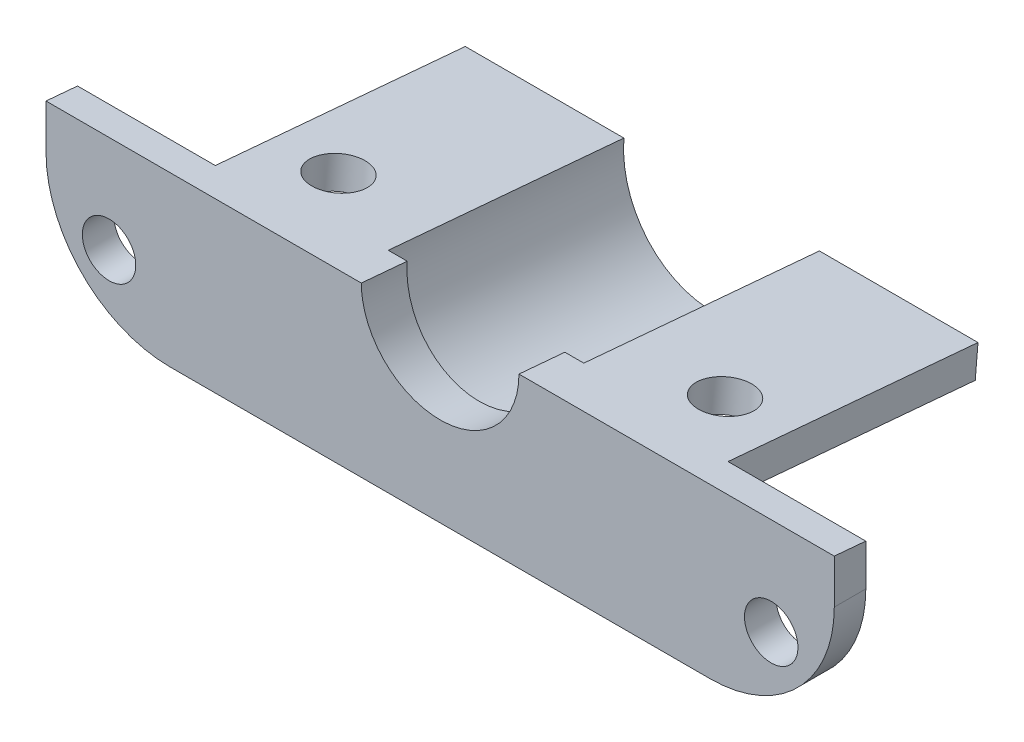
ISO-10303-21;
HEADER;
FILE_DESCRIPTION(('STEP AP214'),'2;1');
FILE_NAME('part.step','',(''),(''),'','','');
FILE_SCHEMA(('AUTOMOTIVE_DESIGN { 1 0 10303 214 1 1 1 1 }'));
ENDSEC;
DATA;
#1=APPLICATION_CONTEXT('core data for automotive mechanical design processes');
#2=APPLICATION_PROTOCOL_DEFINITION('international standard','automotive_design',2000,#1);
#3=PRODUCT_CONTEXT('',#1,'mechanical');
#4=PRODUCT('Part','Part','',(#3));
#5=PRODUCT_RELATED_PRODUCT_CATEGORY('part','',(#4));
#6=PRODUCT_DEFINITION_FORMATION('','',#4);
#7=PRODUCT_DEFINITION_CONTEXT('part definition',#1,'design');
#8=PRODUCT_DEFINITION('design','',#6,#7);
#9=PRODUCT_DEFINITION_SHAPE('','',#8);
#10=(LENGTH_UNIT() NAMED_UNIT(*) SI_UNIT(.MILLI.,.METRE.));
#11=(NAMED_UNIT(*) PLANE_ANGLE_UNIT() SI_UNIT($,.RADIAN.));
#12=(NAMED_UNIT(*) SI_UNIT($,.STERADIAN.) SOLID_ANGLE_UNIT());
#13=UNCERTAINTY_MEASURE_WITH_UNIT(LENGTH_MEASURE(1.E-05),#10,'distance_accuracy_value','');
#14=(GEOMETRIC_REPRESENTATION_CONTEXT(3) GLOBAL_UNCERTAINTY_ASSIGNED_CONTEXT((#13)) GLOBAL_UNIT_ASSIGNED_CONTEXT((#10,
#11,#12)) REPRESENTATION_CONTEXT('',''));
#15=CARTESIAN_POINT('',(0.,0.,0.));
#16=DIRECTION('',(0.,0.,1.));
#17=DIRECTION('',(1.,0.,0.));
#18=AXIS2_PLACEMENT_3D('',#15,#16,#17);
#19=CARTESIAN_POINT('',(0.,3.94962780103435,-0.34554765773733));
#20=DIRECTION('',(0.,0.996194698091746,-0.0871557427476584));
#21=DIRECTION('',(0.,0.0871557427476584,0.996194698091746));
#22=AXIS2_PLACEMENT_3D('',#19,#20,#21);
#23=PLANE('',#22);
#24=DIRECTION('',(0.,-0.0871557427476584,-0.996194698091745));
#25=VECTOR('',#24,1.);
#26=CARTESIAN_POINT('',(6.35,0.222315625568186,-42.9489207720347));
#27=LINE('',#26,#25);
#28=CARTESIAN_POINT('',(6.35,-0.101294306791094,-46.6477992245943));
#29=VERTEX_POINT('',#28);
#30=CARTESIAN_POINT('',(6.35,0.222221205355858,-42.95));
#31=VERTEX_POINT('',#30);
#32=EDGE_CURVE('E62',#29,#31,#27,.F.);
#33=ORIENTED_EDGE('',*,*,#32,.T.);
#34=DIRECTION('',(1.,0.,0.));
#35=VECTOR('',#34,1.);
#36=CARTESIAN_POINT('',(0.,0.222221205355855,-42.95));
#37=LINE('',#36,#35);
#38=CARTESIAN_POINT('',(31.75,0.222221205355855,-42.95));
#39=VERTEX_POINT('',#38);
#40=EDGE_CURVE('E176',#31,#39,#37,.T.);
#41=ORIENTED_EDGE('',*,*,#40,.T.);
#42=DIRECTION('',(0.,-0.0871557427476584,-0.996194698091746));
#43=VECTOR('',#42,1.);
#44=CARTESIAN_POINT('',(31.75,0.,-45.49));
#45=LINE('',#44,#43);
#46=CARTESIAN_POINT('',(31.75,0.,-45.49));
#47=VERTEX_POINT('',#46);
#48=EDGE_CURVE('E190',#39,#47,#45,.T.);
#49=ORIENTED_EDGE('',*,*,#48,.T.);
#50=DIRECTION('',(1.,0.,0.));
#51=VECTOR('',#50,1.);
#52=CARTESIAN_POINT('',(0.,0.,-45.49));
#53=LINE('',#52,#51);
#54=CARTESIAN_POINT('',(20.65192189258,0.,-45.49));
#55=VERTEX_POINT('',#54);
#56=EDGE_CURVE('E275',#55,#47,#53,.T.);
#57=ORIENTED_EDGE('',*,*,#56,.F.);
#58=DIRECTION('',(0.,-0.0871557427476584,-0.996194698091746));
#59=VECTOR('',#58,1.);
#60=CARTESIAN_POINT('',(20.65192189258,0.322001803913616,-41.8095025396841));
#61=LINE('',#60,#59);
#62=CARTESIAN_POINT('',(20.65192189258,-1.76161120613399,-65.625308223242));
#63=VERTEX_POINT('',#62);
#64=EDGE_CURVE('E198',#55,#63,#61,.T.);
#65=ORIENTED_EDGE('',*,*,#64,.T.);
#66=DIRECTION('',(1.,0.,0.));
#67=VECTOR('',#66,1.);
#68=CARTESIAN_POINT('',(0.,-1.76161120613399,-65.625308223242));
#69=LINE('',#68,#67);
#70=CARTESIAN_POINT('',(7.874,-1.76161120613399,-65.625308223242));
#71=VERTEX_POINT('',#70);
#72=EDGE_CURVE('E266',#71,#63,#69,.T.);
#73=ORIENTED_EDGE('',*,*,#72,.F.);
#74=DIRECTION('',(0.,0.0871557427476584,0.996194698091746));
#75=VECTOR('',#74,1.);
#76=CARTESIAN_POINT('',(7.874,-1.76161120613399,-65.625308223242));
#77=LINE('',#76,#75);
#78=CARTESIAN_POINT('',(7.874,-0.101294306791093,-46.6477992245943));
#79=VERTEX_POINT('',#78);
#80=EDGE_CURVE('E267',#79,#71,#77,.F.);
#81=ORIENTED_EDGE('',*,*,#80,.F.);
#82=DIRECTION('',(1.,0.,0.));
#83=VECTOR('',#82,1.);
#84=CARTESIAN_POINT('',(0.,-0.101294306791096,-46.6477992245943));
#85=LINE('',#84,#83);
#86=EDGE_CURVE('E262',#29,#79,#85,.T.);
#87=ORIENTED_EDGE('',*,*,#86,.F.);
#88=EDGE_LOOP('',(#33,#41,#49,#57,#65,#73,#81,#87));
#89=FACE_BOUND('',#88,.T.);
#90=CARTESIAN_POINT('',(15.57192189258,-0.423383318951028,-50.329293479727));
#91=DIRECTION('',(0.,0.996194698091746,-0.0871557427476584));
#92=DIRECTION('',(0.,0.0871557427476584,0.996194698091746));
#93=AXIS2_PLACEMENT_3D('',#90,#91,#92);
#94=CIRCLE('',#93,2.15265);
#95=CARTESIAN_POINT('',(15.57192189258,-0.235767509325281,-48.1848349628798));
#96=VERTEX_POINT('',#95);
#97=EDGE_CURVE('E178',#96,#96,#94,.F.);
#98=ORIENTED_EDGE('',*,*,#97,.T.);
#99=EDGE_LOOP('',(#98));
#100=FACE_BOUND('',#99,.T.);
#101=ADVANCED_FACE('F44',(#89,#100),#23,.T.);
#102=DIRECTION('',(0.,-0.0871557427476584,-0.996194698091745));
#103=VECTOR('',#102,1.);
#104=CARTESIAN_POINT('',(-6.35,0.222315625568181,-42.9489207720347));
#105=LINE('',#104,#103);
#106=CARTESIAN_POINT('',(-6.35,0.222221205355853,-42.95));
#107=VERTEX_POINT('',#106);
#108=CARTESIAN_POINT('',(-6.35,-0.101294306791098,-46.6477992245943));
#109=VERTEX_POINT('',#108);
#110=EDGE_CURVE('E160',#107,#109,#105,.T.);
#111=ORIENTED_EDGE('',*,*,#110,.T.);
#112=CARTESIAN_POINT('',(-7.874,-0.101294306791099,-46.6477992245943));
#113=VERTEX_POINT('',#112);
#114=EDGE_CURVE('E258',#113,#109,#85,.T.);
#115=ORIENTED_EDGE('',*,*,#114,.F.);
#116=DIRECTION('',(0.,0.0871557427476584,0.996194698091746));
#117=VECTOR('',#116,1.);
#118=CARTESIAN_POINT('',(-7.874,-1.76161120613399,-65.625308223242));
#119=LINE('',#118,#117);
#120=CARTESIAN_POINT('',(-7.874,-1.76161120613399,-65.625308223242));
#121=VERTEX_POINT('',#120);
#122=EDGE_CURVE('E271',#121,#113,#119,.T.);
#123=ORIENTED_EDGE('',*,*,#122,.F.);
#124=CARTESIAN_POINT('',(-20.65192189258,-1.76161120613399,-65.625308223242));
#125=VERTEX_POINT('',#124);
#126=EDGE_CURVE('E263',#125,#121,#69,.T.);
#127=ORIENTED_EDGE('',*,*,#126,.F.);
#128=DIRECTION('',(0.,0.0871557427476584,0.996194698091746));
#129=VECTOR('',#128,1.);
#130=CARTESIAN_POINT('',(-20.65192189258,0.322001803913602,-41.8095025396841));
#131=LINE('',#130,#129);
#132=CARTESIAN_POINT('',(-20.65192189258,0.,-45.49));
#133=VERTEX_POINT('',#132);
#134=EDGE_CURVE('E192',#125,#133,#131,.T.);
#135=ORIENTED_EDGE('',*,*,#134,.T.);
#136=CARTESIAN_POINT('',(-31.75,0.,-45.49));
#137=VERTEX_POINT('',#136);
#138=EDGE_CURVE('E276',#137,#133,#53,.T.);
#139=ORIENTED_EDGE('',*,*,#138,.F.);
#140=DIRECTION('',(0.,0.0871557427476584,0.996194698091746));
#141=VECTOR('',#140,1.);
#142=CARTESIAN_POINT('',(-31.75,0.,-45.49));
#143=LINE('',#142,#141);
#144=CARTESIAN_POINT('',(-31.75,0.222221205355855,-42.95));
#145=VERTEX_POINT('',#144);
#146=EDGE_CURVE('E185',#137,#145,#143,.T.);
#147=ORIENTED_EDGE('',*,*,#146,.T.);
#148=EDGE_CURVE('E174',#145,#107,#37,.T.);
#149=ORIENTED_EDGE('',*,*,#148,.T.);
#150=EDGE_LOOP('',(#111,#115,#123,#127,#135,#139,#147,#149));
#151=FACE_BOUND('',#150,.T.);
#152=CARTESIAN_POINT('',(-15.57192189258,-0.423383318951039,-50.329293479727));
#153=DIRECTION('',(0.,0.996194698091746,-0.0871557427476584));
#154=DIRECTION('',(0.,0.0871557427476584,0.996194698091746));
#155=AXIS2_PLACEMENT_3D('',#152,#153,#154);
#156=CIRCLE('',#155,2.15265);
#157=CARTESIAN_POINT('',(-15.57192189258,-0.235767509325292,-48.1848349628798));
#158=VERTEX_POINT('',#157);
#159=EDGE_CURVE('E202',#158,#158,#156,.F.);
#160=ORIENTED_EDGE('',*,*,#159,.T.);
#161=EDGE_LOOP('',(#160));
#162=FACE_BOUND('',#161,.T.);
#163=ADVANCED_FACE('F181',(#151,#162),#23,.T.);
#164=CARTESIAN_POINT('',(0.,0.,-45.49));
#165=DIRECTION('',(0.,0.,-1.));
#166=DIRECTION('',(-1.,0.,0.));
#167=AXIS2_PLACEMENT_3D('',#164,#165,#166);
#168=PLANE('',#167);
#169=CARTESIAN_POINT('',(26.67,-7.62,-45.49));
#170=DIRECTION('',(0.,0.,-1.));
#171=DIRECTION('',(-1.,0.,0.));
#172=AXIS2_PLACEMENT_3D('',#169,#170,#171);
#173=CIRCLE('',#172,2.15265);
#174=CARTESIAN_POINT('',(24.51735,-7.62,-45.49));
#175=VERTEX_POINT('',#174);
#176=EDGE_CURVE('E324',#175,#175,#173,.F.);
#177=ORIENTED_EDGE('',*,*,#176,.T.);
#178=EDGE_LOOP('',(#177));
#179=FACE_BOUND('',#178,.T.);
#180=CARTESIAN_POINT('',(-26.67,-7.62,-45.49));
#181=DIRECTION('',(0.,0.,-1.));
#182=DIRECTION('',(-1.,0.,0.));
#183=AXIS2_PLACEMENT_3D('',#180,#181,#182);
#184=CIRCLE('',#183,2.15265);
#185=CARTESIAN_POINT('',(-28.82265,-7.62,-45.49));
#186=VERTEX_POINT('',#185);
#187=EDGE_CURVE('E213',#186,#186,#184,.F.);
#188=ORIENTED_EDGE('',*,*,#187,.T.);
#189=EDGE_LOOP('',(#188));
#190=FACE_BOUND('',#189,.T.);
#191=DIRECTION('',(0.,1.,0.));
#192=VECTOR('',#191,1.);
#193=CARTESIAN_POINT('',(-31.75,0.,-45.49));
#194=LINE('',#193,#192);
#195=CARTESIAN_POINT('',(-31.75,-3.335,-45.49));
#196=VERTEX_POINT('',#195);
#197=EDGE_CURVE('E209',#196,#137,#194,.T.);
#198=ORIENTED_EDGE('',*,*,#197,.T.);
#199=ORIENTED_EDGE('',*,*,#138,.T.);
#200=DIRECTION('',(0.,1.,0.));
#201=VECTOR('',#200,1.);
#202=CARTESIAN_POINT('',(-20.65192189258,-3.62762599712074,-45.49));
#203=LINE('',#202,#201);
#204=CARTESIAN_POINT('',(-20.65192189258,-2.54970238736011,-45.49));
#205=VERTEX_POINT('',#204);
#206=EDGE_CURVE('E230',#205,#133,#203,.T.);
#207=ORIENTED_EDGE('',*,*,#206,.F.);
#208=DIRECTION('',(1.,0.,0.));
#209=VECTOR('',#208,1.);
#210=CARTESIAN_POINT('',(0.,-2.54970238736011,-45.49));
#211=LINE('',#210,#209);
#212=CARTESIAN_POINT('',(-10.49192189258,-2.54970238736011,-45.49));
#213=VERTEX_POINT('',#212);
#214=EDGE_CURVE('E234',#205,#213,#211,.T.);
#215=ORIENTED_EDGE('',*,*,#214,.T.);
#216=CARTESIAN_POINT('',(0.,0.,-45.49));
#217=DIRECTION('',(0.,0.,-1.));
#218=DIRECTION('',(0.,-1.,0.));
#219=AXIS2_PLACEMENT_3D('',#216,#217,#218);
#220=ELLIPSE('',#219,10.8362351462804,10.795);
#221=CARTESIAN_POINT('',(10.49192189258,-2.54970238736011,-45.49));
#222=VERTEX_POINT('',#221);
#223=EDGE_CURVE('E240',#213,#222,#220,.F.);
#224=ORIENTED_EDGE('',*,*,#223,.T.);
#225=DIRECTION('',(1.,0.,0.));
#226=VECTOR('',#225,1.);
#227=CARTESIAN_POINT('',(0.,-2.54970238736012,-45.49));
#228=LINE('',#227,#226);
#229=CARTESIAN_POINT('',(20.65192189258,-2.54970238736011,-45.49));
#230=VERTEX_POINT('',#229);
#231=EDGE_CURVE('E355',#222,#230,#228,.T.);
#232=ORIENTED_EDGE('',*,*,#231,.T.);
#233=DIRECTION('',(0.,-1.,0.));
#234=VECTOR('',#233,1.);
#235=CARTESIAN_POINT('',(20.65192189258,-3.62762599712074,-45.49));
#236=LINE('',#235,#234);
#237=EDGE_CURVE('E227',#55,#230,#236,.T.);
#238=ORIENTED_EDGE('',*,*,#237,.F.);
#239=ORIENTED_EDGE('',*,*,#56,.T.);
#240=DIRECTION('',(0.,-1.,0.));
#241=VECTOR('',#240,1.);
#242=CARTESIAN_POINT('',(31.75,0.,-45.49));
#243=LINE('',#242,#241);
#244=CARTESIAN_POINT('',(31.75,-3.335,-45.49));
#245=VERTEX_POINT('',#244);
#246=EDGE_CURVE('E214',#47,#245,#243,.T.);
#247=ORIENTED_EDGE('',*,*,#246,.T.);
#248=CARTESIAN_POINT('',(21.75,-3.335,-45.49));
#249=DIRECTION('',(0.,0.,-1.));
#250=DIRECTION('',(-1.,0.,0.));
#251=AXIS2_PLACEMENT_3D('',#248,#249,#250);
#252=CIRCLE('',#251,10.);
#253=CARTESIAN_POINT('',(21.75,-13.335,-45.49));
#254=VERTEX_POINT('',#253);
#255=EDGE_CURVE('E303',#245,#254,#252,.T.);
#256=ORIENTED_EDGE('',*,*,#255,.T.);
#257=DIRECTION('',(-1.,0.,0.));
#258=VECTOR('',#257,1.);
#259=CARTESIAN_POINT('',(0.,-13.335,-45.49));
#260=LINE('',#259,#258);
#261=CARTESIAN_POINT('',(-21.75,-13.335,-45.49));
#262=VERTEX_POINT('',#261);
#263=EDGE_CURVE('E212',#254,#262,#260,.T.);
#264=ORIENTED_EDGE('',*,*,#263,.T.);
#265=CARTESIAN_POINT('',(-21.75,-3.335,-45.49));
#266=DIRECTION('',(0.,0.,-1.));
#267=DIRECTION('',(-1.,0.,0.));
#268=AXIS2_PLACEMENT_3D('',#265,#266,#267);
#269=CIRCLE('',#268,10.);
#270=EDGE_CURVE('E306',#262,#196,#269,.T.);
#271=ORIENTED_EDGE('',*,*,#270,.T.);
#272=EDGE_LOOP('',(#198,#199,#207,#215,#224,#232,#238,#239,#247,#256,#264,#271));
#273=FACE_BOUND('',#272,.T.);
#274=ADVANCED_FACE('F295',(#179,#190,#273),#168,.T.);
#275=CARTESIAN_POINT('',(31.75,0.,-45.49));
#276=DIRECTION('',(-1.,0.,0.));
#277=DIRECTION('',(0.,-1.,0.));
#278=AXIS2_PLACEMENT_3D('',#275,#276,#277);
#279=PLANE('',#278);
#280=ORIENTED_EDGE('',*,*,#48,.F.);
#281=DIRECTION('',(0.,-1.,0.));
#282=VECTOR('',#281,1.);
#283=CARTESIAN_POINT('',(31.75,0.,-42.95));
#284=LINE('',#283,#282);
#285=CARTESIAN_POINT('',(31.75,-3.335,-42.95));
#286=VERTEX_POINT('',#285);
#287=EDGE_CURVE('E223',#39,#286,#284,.T.);
#288=ORIENTED_EDGE('',*,*,#287,.T.);
#289=DIRECTION('',(0.,0.,1.));
#290=VECTOR('',#289,1.);
#291=CARTESIAN_POINT('',(31.75,-3.335,-45.49));
#292=LINE('',#291,#290);
#293=EDGE_CURVE('E292',#286,#245,#292,.F.);
#294=ORIENTED_EDGE('',*,*,#293,.T.);
#295=ORIENTED_EDGE('',*,*,#246,.F.);
#296=EDGE_LOOP('',(#280,#288,#294,#295));
#297=FACE_BOUND('',#296,.T.);
#298=ADVANCED_FACE('F288',(#297),#279,.F.);
#299=CARTESIAN_POINT('',(-31.75,0.,-45.49));
#300=DIRECTION('',(1.,0.,0.));
#301=DIRECTION('',(0.,0.,-1.));
#302=AXIS2_PLACEMENT_3D('',#299,#300,#301);
#303=PLANE('',#302);
#304=ORIENTED_EDGE('',*,*,#146,.F.);
#305=ORIENTED_EDGE('',*,*,#197,.F.);
#306=DIRECTION('',(0.,0.,1.));
#307=VECTOR('',#306,1.);
#308=CARTESIAN_POINT('',(-31.75,-3.335,-45.49));
#309=LINE('',#308,#307);
#310=CARTESIAN_POINT('',(-31.75,-3.335,-42.95));
#311=VERTEX_POINT('',#310);
#312=EDGE_CURVE('E261',#196,#311,#309,.T.);
#313=ORIENTED_EDGE('',*,*,#312,.T.);
#314=DIRECTION('',(0.,1.,0.));
#315=VECTOR('',#314,1.);
#316=CARTESIAN_POINT('',(-31.75,0.,-42.95));
#317=LINE('',#316,#315);
#318=EDGE_CURVE('E218',#311,#145,#317,.T.);
#319=ORIENTED_EDGE('',*,*,#318,.T.);
#320=EDGE_LOOP('',(#304,#305,#313,#319));
#321=FACE_BOUND('',#320,.T.);
#322=ADVANCED_FACE('F422',(#321),#303,.F.);
#323=CARTESIAN_POINT('',(0.,0.,-42.95));
#324=DIRECTION('',(0.,0.,-1.));
#325=DIRECTION('',(-1.,0.,0.));
#326=AXIS2_PLACEMENT_3D('',#323,#324,#325);
#327=PLANE('',#326);
#328=CARTESIAN_POINT('',(26.67,-7.62,-42.95));
#329=DIRECTION('',(0.,0.,-1.));
#330=DIRECTION('',(-1.,0.,0.));
#331=AXIS2_PLACEMENT_3D('',#328,#329,#330);
#332=CIRCLE('',#331,2.15265);
#333=CARTESIAN_POINT('',(24.51735,-7.62,-42.95));
#334=VERTEX_POINT('',#333);
#335=EDGE_CURVE('E217',#334,#334,#332,.F.);
#336=ORIENTED_EDGE('',*,*,#335,.F.);
#337=EDGE_LOOP('',(#336));
#338=FACE_BOUND('',#337,.T.);
#339=CARTESIAN_POINT('',(-26.67,-7.62,-42.95));
#340=DIRECTION('',(0.,0.,-1.));
#341=DIRECTION('',(-1.,0.,0.));
#342=AXIS2_PLACEMENT_3D('',#339,#340,#341);
#343=CIRCLE('',#342,2.15265);
#344=CARTESIAN_POINT('',(-28.82265,-7.62,-42.95));
#345=VERTEX_POINT('',#344);
#346=EDGE_CURVE('E222',#345,#345,#343,.F.);
#347=ORIENTED_EDGE('',*,*,#346,.F.);
#348=EDGE_LOOP('',(#347));
#349=FACE_BOUND('',#348,.T.);
#350=ORIENTED_EDGE('',*,*,#40,.F.);
#351=CARTESIAN_POINT('',(0.,0.222221205355858,-42.95));
#352=DIRECTION('',(0.,0.,-1.));
#353=DIRECTION('',(0.,-1.,0.));
#354=AXIS2_PLACEMENT_3D('',#351,#352,#353);
#355=ELLIPSE('',#354,6.37425596840026,6.35);
#356=EDGE_CURVE('E163',#107,#31,#355,.F.);
#357=ORIENTED_EDGE('',*,*,#356,.F.);
#358=ORIENTED_EDGE('',*,*,#148,.F.);
#359=ORIENTED_EDGE('',*,*,#318,.F.);
#360=CARTESIAN_POINT('',(-21.75,-3.335,-42.95));
#361=DIRECTION('',(0.,0.,-1.));
#362=DIRECTION('',(-1.,0.,0.));
#363=AXIS2_PLACEMENT_3D('',#360,#361,#362);
#364=CIRCLE('',#363,10.);
#365=CARTESIAN_POINT('',(-21.75,-13.335,-42.95));
#366=VERTEX_POINT('',#365);
#367=EDGE_CURVE('E314',#311,#366,#364,.F.);
#368=ORIENTED_EDGE('',*,*,#367,.T.);
#369=DIRECTION('',(-1.,0.,0.));
#370=VECTOR('',#369,1.);
#371=CARTESIAN_POINT('',(0.,-13.335,-42.95));
#372=LINE('',#371,#370);
#373=CARTESIAN_POINT('',(21.75,-13.335,-42.95));
#374=VERTEX_POINT('',#373);
#375=EDGE_CURVE('E221',#374,#366,#372,.T.);
#376=ORIENTED_EDGE('',*,*,#375,.F.);
#377=CARTESIAN_POINT('',(21.75,-3.335,-42.95));
#378=DIRECTION('',(0.,0.,-1.));
#379=DIRECTION('',(-1.,0.,0.));
#380=AXIS2_PLACEMENT_3D('',#377,#378,#379);
#381=CIRCLE('',#380,10.);
#382=EDGE_CURVE('E311',#374,#286,#381,.F.);
#383=ORIENTED_EDGE('',*,*,#382,.T.);
#384=ORIENTED_EDGE('',*,*,#287,.F.);
#385=EDGE_LOOP('',(#350,#357,#358,#359,#368,#376,#383,#384));
#386=FACE_BOUND('',#385,.T.);
#387=ADVANCED_FACE('F46',(#338,#349,#386),#327,.F.);
#388=CARTESIAN_POINT('',(-20.65192189258,-3.62762599712074,-41.4639548819467));
#389=DIRECTION('',(1.,0.,0.));
#390=DIRECTION('',(0.,0.,-1.));
#391=AXIS2_PLACEMENT_3D('',#388,#389,#390);
#392=PLANE('',#391);
#393=ORIENTED_EDGE('',*,*,#134,.F.);
#394=DIRECTION('',(0.,-0.996194698091746,0.0871557427476584));
#395=VECTOR('',#394,1.);
#396=CARTESIAN_POINT('',(-20.65192189258,-5.71123900716834,-65.2797605655047));
#397=LINE('',#396,#395);
#398=CARTESIAN_POINT('',(-20.65192189258,-4.29194573928703,-65.403932636663));
#399=VERTEX_POINT('',#398);
#400=EDGE_CURVE('E70',#125,#399,#397,.T.);
#401=ORIENTED_EDGE('',*,*,#400,.T.);
#402=DIRECTION('',(0.,-0.0871557427476584,-0.996194698091746));
#403=VECTOR('',#402,1.);
#404=CARTESIAN_POINT('',(-20.65192189258,-2.20833272923944,-41.588126953105));
#405=LINE('',#404,#403);
#406=EDGE_CURVE('E231',#205,#399,#405,.T.);
#407=ORIENTED_EDGE('',*,*,#406,.F.);
#408=ORIENTED_EDGE('',*,*,#206,.T.);
#409=EDGE_LOOP('',(#393,#401,#407,#408));
#410=FACE_BOUND('',#409,.T.);
#411=ADVANCED_FACE('F377',(#410),#392,.F.);
#412=CARTESIAN_POINT('',(20.65192189258,-3.62762599712074,-41.4639548819467));
#413=DIRECTION('',(-1.,0.,0.));
#414=DIRECTION('',(0.,0.,1.));
#415=AXIS2_PLACEMENT_3D('',#412,#413,#414);
#416=PLANE('',#415);
#417=ORIENTED_EDGE('',*,*,#64,.F.);
#418=ORIENTED_EDGE('',*,*,#237,.T.);
#419=DIRECTION('',(0.,-0.0871557427476584,-0.996194698091746));
#420=VECTOR('',#419,1.);
#421=CARTESIAN_POINT('',(20.65192189258,-2.20833272923944,-41.588126953105));
#422=LINE('',#421,#420);
#423=CARTESIAN_POINT('',(20.65192189258,-4.29194573928703,-65.403932636663));
#424=VERTEX_POINT('',#423);
#425=EDGE_CURVE('E348',#230,#424,#422,.T.);
#426=ORIENTED_EDGE('',*,*,#425,.T.);
#427=DIRECTION('',(0.,0.996194698091746,-0.0871557427476584));
#428=VECTOR('',#427,1.);
#429=CARTESIAN_POINT('',(20.65192189258,-5.71123900716834,-65.2797605655047));
#430=LINE('',#429,#428);
#431=EDGE_CURVE('E241',#424,#63,#430,.T.);
#432=ORIENTED_EDGE('',*,*,#431,.T.);
#433=EDGE_LOOP('',(#417,#418,#426,#432));
#434=FACE_BOUND('',#433,.T.);
#435=ADVANCED_FACE('F387',(#434),#416,.F.);
#436=CARTESIAN_POINT('',(0.,-1.761611206134,-65.625308223242));
#437=DIRECTION('',(0.,0.0871557427476584,0.996194698091746));
#438=DIRECTION('',(0.,-0.996194698091746,0.0871557427476584));
#439=AXIS2_PLACEMENT_3D('',#436,#437,#438);
#440=CYLINDRICAL_SURFACE('',#439,7.874);
#441=CARTESIAN_POINT('',(0.,-1.761611206134,-65.625308223242));
#442=DIRECTION('',(0.,-0.0871557427476584,-0.996194698091746));
#443=DIRECTION('',(0.,0.996194698091746,-0.0871557427476584));
#444=AXIS2_PLACEMENT_3D('',#441,#442,#443);
#445=CIRCLE('',#444,7.874);
#446=EDGE_CURVE('E235',#71,#121,#445,.T.);
#447=ORIENTED_EDGE('',*,*,#446,.T.);
#448=ORIENTED_EDGE('',*,*,#122,.T.);
#449=CARTESIAN_POINT('',(0.,-0.101294306791106,-46.6477992245943));
#450=DIRECTION('',(0.,-0.0871557427476584,-0.996194698091746));
#451=DIRECTION('',(0.,0.996194698091746,-0.0871557427476584));
#452=AXIS2_PLACEMENT_3D('',#449,#450,#451);
#453=CIRCLE('',#452,7.874);
#454=EDGE_CURVE('E48',#79,#113,#453,.T.);
#455=ORIENTED_EDGE('',*,*,#454,.F.);
#456=ORIENTED_EDGE('',*,*,#80,.T.);
#457=EDGE_LOOP('',(#447,#448,#455,#456));
#458=FACE_BOUND('',#457,.T.);
#459=ADVANCED_FACE('F382',(#458),#440,.F.);
#460=CARTESIAN_POINT('',(0.,-5.71123900716834,-65.2797605655047));
#461=DIRECTION('',(0.,-0.0871557427476584,-0.996194698091746));
#462=DIRECTION('',(0.,0.996194698091746,-0.0871557427476584));
#463=AXIS2_PLACEMENT_3D('',#460,#461,#462);
#464=PLANE('',#463);
#465=ORIENTED_EDGE('',*,*,#400,.F.);
#466=ORIENTED_EDGE('',*,*,#126,.T.);
#467=ORIENTED_EDGE('',*,*,#446,.F.);
#468=ORIENTED_EDGE('',*,*,#72,.T.);
#469=ORIENTED_EDGE('',*,*,#431,.F.);
#470=DIRECTION('',(-1.,0.,0.));
#471=VECTOR('',#470,1.);
#472=CARTESIAN_POINT('',(0.,-4.29194573928705,-65.403932636663));
#473=LINE('',#472,#471);
#474=CARTESIAN_POINT('',(10.49192189258,-4.29194573928704,-65.403932636663));
#475=VERTEX_POINT('',#474);
#476=EDGE_CURVE('E244',#424,#475,#473,.T.);
#477=ORIENTED_EDGE('',*,*,#476,.T.);
#478=CARTESIAN_POINT('',(0.,-1.761611206134,-65.625308223242));
#479=DIRECTION('',(0.,-0.0871557427476584,-0.996194698091746));
#480=DIRECTION('',(0.,0.996194698091746,-0.0871557427476584));
#481=AXIS2_PLACEMENT_3D('',#478,#479,#480);
#482=CIRCLE('',#481,10.795);
#483=CARTESIAN_POINT('',(-10.49192189258,-4.29194573928704,-65.403932636663));
#484=VERTEX_POINT('',#483);
#485=EDGE_CURVE('E239',#475,#484,#482,.T.);
#486=ORIENTED_EDGE('',*,*,#485,.T.);
#487=DIRECTION('',(-1.,0.,0.));
#488=VECTOR('',#487,1.);
#489=CARTESIAN_POINT('',(0.,-4.29194573928704,-65.403932636663));
#490=LINE('',#489,#488);
#491=EDGE_CURVE('E246',#484,#399,#490,.T.);
#492=ORIENTED_EDGE('',*,*,#491,.T.);
#493=EDGE_LOOP('',(#465,#466,#467,#468,#469,#477,#486,#492));
#494=FACE_BOUND('',#493,.T.);
#495=ADVANCED_FACE('F366',(#494),#464,.T.);
#496=CARTESIAN_POINT('',(0.,-4.05092210782545,-46.3022515668569));
#497=DIRECTION('',(0.,-0.0871557427476584,-0.996194698091746));
#498=DIRECTION('',(0.,0.996194698091746,-0.0871557427476584));
#499=AXIS2_PLACEMENT_3D('',#496,#497,#498);
#500=PLANE('',#499);
#501=CARTESIAN_POINT('',(0.,-0.101294306791095,-46.6477992245943));
#502=DIRECTION('',(0.,-0.0871557427476584,-0.996194698091746));
#503=DIRECTION('',(0.,0.996194698091746,-0.0871557427476584));
#504=AXIS2_PLACEMENT_3D('',#501,#502,#503);
#505=CIRCLE('',#504,6.35);
#506=EDGE_CURVE('E164',#29,#109,#505,.T.);
#507=ORIENTED_EDGE('',*,*,#506,.F.);
#508=ORIENTED_EDGE('',*,*,#86,.T.);
#509=ORIENTED_EDGE('',*,*,#454,.T.);
#510=ORIENTED_EDGE('',*,*,#114,.T.);
#511=EDGE_LOOP('',(#507,#508,#509,#510));
#512=FACE_BOUND('',#511,.T.);
#513=ADVANCED_FACE('F428',(#512),#500,.T.);
#514=CARTESIAN_POINT('',(-15.57192189258,-16.8705577844458,-48.8903521669632));
#515=DIRECTION('',(0.,0.996194698091746,-0.0871557427476584));
#516=DIRECTION('',(0.,0.0871557427476584,0.996194698091746));
#517=AXIS2_PLACEMENT_3D('',#514,#515,#516);
#518=CYLINDRICAL_SURFACE('',#517,2.15265);
#519=CARTESIAN_POINT('',(-15.57192189258,-2.95371785210407,-50.107917893148));
#520=DIRECTION('',(0.,-0.996194698091746,0.0871557427476584));
#521=DIRECTION('',(0.,-0.0871557427476584,-0.996194698091746));
#522=AXIS2_PLACEMENT_3D('',#519,#520,#521);
#523=CIRCLE('',#522,2.15265);
#524=CARTESIAN_POINT('',(-15.57192189258,-3.14133366172982,-52.2523764099952));
#525=VERTEX_POINT('',#524);
#526=EDGE_CURVE('E11',#525,#525,#523,.T.);
#527=ORIENTED_EDGE('',*,*,#526,.T.);
#528=EDGE_LOOP('',(#527));
#529=FACE_BOUND('',#528,.T.);
#530=ORIENTED_EDGE('',*,*,#159,.F.);
#531=EDGE_LOOP('',(#530));
#532=FACE_BOUND('',#531,.T.);
#533=ADVANCED_FACE('F431',(#529,#532),#518,.F.);
#534=CARTESIAN_POINT('',(15.57192189258,-16.8705577844457,-48.8903521669632));
#535=DIRECTION('',(0.,0.996194698091746,-0.0871557427476584));
#536=DIRECTION('',(0.,0.0871557427476584,0.996194698091746));
#537=AXIS2_PLACEMENT_3D('',#534,#535,#536);
#538=CYLINDRICAL_SURFACE('',#537,2.15265);
#539=CARTESIAN_POINT('',(15.57192189258,-2.95371785210408,-50.107917893148));
#540=DIRECTION('',(0.,-0.996194698091746,0.0871557427476584));
#541=DIRECTION('',(0.,-0.0871557427476584,-0.996194698091746));
#542=AXIS2_PLACEMENT_3D('',#539,#540,#541);
#543=CIRCLE('',#542,2.15265);
#544=CARTESIAN_POINT('',(15.57192189258,-3.14133366172982,-52.2523764099952));
#545=VERTEX_POINT('',#544);
#546=EDGE_CURVE('E54',#545,#545,#543,.T.);
#547=ORIENTED_EDGE('',*,*,#546,.T.);
#548=EDGE_LOOP('',(#547));
#549=FACE_BOUND('',#548,.T.);
#550=ORIENTED_EDGE('',*,*,#97,.F.);
#551=EDGE_LOOP('',(#550));
#552=FACE_BOUND('',#551,.T.);
#553=ADVANCED_FACE('F435',(#549,#552),#538,.F.);
#554=CARTESIAN_POINT('',(0.,-13.335,-45.49));
#555=DIRECTION('',(0.,1.,0.));
#556=DIRECTION('',(0.,0.,1.));
#557=AXIS2_PLACEMENT_3D('',#554,#555,#556);
#558=PLANE('',#557);
#559=ORIENTED_EDGE('',*,*,#263,.F.);
#560=DIRECTION('',(0.,0.,1.));
#561=VECTOR('',#560,1.);
#562=CARTESIAN_POINT('',(21.75,-13.335,-45.49));
#563=LINE('',#562,#561);
#564=EDGE_CURVE('E317',#254,#374,#563,.T.);
#565=ORIENTED_EDGE('',*,*,#564,.T.);
#566=ORIENTED_EDGE('',*,*,#375,.T.);
#567=DIRECTION('',(0.,0.,1.));
#568=VECTOR('',#567,1.);
#569=CARTESIAN_POINT('',(-21.75,-13.335,-45.49));
#570=LINE('',#569,#568);
#571=EDGE_CURVE('E321',#366,#262,#570,.F.);
#572=ORIENTED_EDGE('',*,*,#571,.T.);
#573=EDGE_LOOP('',(#559,#565,#566,#572));
#574=FACE_BOUND('',#573,.T.);
#575=ADVANCED_FACE('F438',(#574),#558,.F.);
#576=CARTESIAN_POINT('',(-26.67,-7.62,-45.49));
#577=DIRECTION('',(0.,0.,1.));
#578=DIRECTION('',(1.,0.,0.));
#579=AXIS2_PLACEMENT_3D('',#576,#577,#578);
#580=CYLINDRICAL_SURFACE('',#579,2.15265);
#581=ORIENTED_EDGE('',*,*,#187,.F.);
#582=EDGE_LOOP('',(#581));
#583=FACE_BOUND('',#582,.T.);
#584=ORIENTED_EDGE('',*,*,#346,.T.);
#585=EDGE_LOOP('',(#584));
#586=FACE_BOUND('',#585,.T.);
#587=ADVANCED_FACE('F401',(#583,#586),#580,.F.);
#588=CARTESIAN_POINT('',(26.67,-7.62,-45.49));
#589=DIRECTION('',(0.,0.,1.));
#590=DIRECTION('',(1.,0.,0.));
#591=AXIS2_PLACEMENT_3D('',#588,#589,#590);
#592=CYLINDRICAL_SURFACE('',#591,2.15265);
#593=ORIENTED_EDGE('',*,*,#176,.F.);
#594=EDGE_LOOP('',(#593));
#595=FACE_BOUND('',#594,.T.);
#596=ORIENTED_EDGE('',*,*,#335,.T.);
#597=EDGE_LOOP('',(#596));
#598=FACE_BOUND('',#597,.T.);
#599=ADVANCED_FACE('F391',(#595,#598),#592,.F.);
#600=CARTESIAN_POINT('',(0.,-2.20833272923945,-41.588126953105));
#601=DIRECTION('',(0.,-0.996194698091746,0.0871557427476584));
#602=DIRECTION('',(0.,-0.0871557427476584,-0.996194698091746));
#603=AXIS2_PLACEMENT_3D('',#600,#601,#602);
#604=PLANE('',#603);
#605=ORIENTED_EDGE('',*,*,#546,.F.);
#606=EDGE_LOOP('',(#605));
#607=FACE_BOUND('',#606,.T.);
#608=ORIENTED_EDGE('',*,*,#231,.F.);
#609=DIRECTION('',(0.,-0.0871557427476584,-0.996194698091746));
#610=VECTOR('',#609,1.);
#611=CARTESIAN_POINT('',(10.49192189258,-2.20833272923944,-41.588126953105));
#612=LINE('',#611,#610);
#613=EDGE_CURVE('E345',#222,#475,#612,.T.);
#614=ORIENTED_EDGE('',*,*,#613,.T.);
#615=ORIENTED_EDGE('',*,*,#476,.F.);
#616=ORIENTED_EDGE('',*,*,#425,.F.);
#617=EDGE_LOOP('',(#608,#614,#615,#616));
#618=FACE_BOUND('',#617,.T.);
#619=ADVANCED_FACE('F389',(#607,#618),#604,.T.);
#620=CARTESIAN_POINT('',(0.,-2.20833272923944,-41.588126953105));
#621=DIRECTION('',(0.,-0.996194698091746,0.0871557427476584));
#622=DIRECTION('',(0.,-0.0871557427476584,-0.996194698091746));
#623=AXIS2_PLACEMENT_3D('',#620,#621,#622);
#624=PLANE('',#623);
#625=ORIENTED_EDGE('',*,*,#526,.F.);
#626=EDGE_LOOP('',(#625));
#627=FACE_BOUND('',#626,.T.);
#628=ORIENTED_EDGE('',*,*,#214,.F.);
#629=ORIENTED_EDGE('',*,*,#406,.T.);
#630=ORIENTED_EDGE('',*,*,#491,.F.);
#631=DIRECTION('',(0.,-0.0871557427476584,-0.996194698091746));
#632=VECTOR('',#631,1.);
#633=CARTESIAN_POINT('',(-10.49192189258,-2.20833272923944,-41.588126953105));
#634=LINE('',#633,#632);
#635=EDGE_CURVE('E226',#213,#484,#634,.T.);
#636=ORIENTED_EDGE('',*,*,#635,.F.);
#637=EDGE_LOOP('',(#628,#629,#630,#636));
#638=FACE_BOUND('',#637,.T.);
#639=ADVANCED_FACE('F376',(#627,#638),#624,.T.);
#640=CARTESIAN_POINT('',(0.,0.322001803913599,-41.8095025396841));
#641=DIRECTION('',(0.,-0.0871557427476584,-0.996194698091746));
#642=DIRECTION('',(0.,0.996194698091746,-0.0871557427476584));
#643=AXIS2_PLACEMENT_3D('',#640,#641,#642);
#644=CYLINDRICAL_SURFACE('',#643,10.795);
#645=ORIENTED_EDGE('',*,*,#223,.F.);
#646=ORIENTED_EDGE('',*,*,#635,.T.);
#647=ORIENTED_EDGE('',*,*,#485,.F.);
#648=ORIENTED_EDGE('',*,*,#613,.F.);
#649=EDGE_LOOP('',(#645,#646,#647,#648));
#650=FACE_BOUND('',#649,.T.);
#651=ADVANCED_FACE('F372',(#650),#644,.T.);
#652=CARTESIAN_POINT('',(21.75,-3.335,-45.49));
#653=DIRECTION('',(0.,0.,1.));
#654=DIRECTION('',(1.,0.,0.));
#655=AXIS2_PLACEMENT_3D('',#652,#653,#654);
#656=CYLINDRICAL_SURFACE('',#655,10.);
#657=ORIENTED_EDGE('',*,*,#255,.F.);
#658=ORIENTED_EDGE('',*,*,#293,.F.);
#659=ORIENTED_EDGE('',*,*,#382,.F.);
#660=ORIENTED_EDGE('',*,*,#564,.F.);
#661=EDGE_LOOP('',(#657,#658,#659,#660));
#662=FACE_BOUND('',#661,.T.);
#663=ADVANCED_FACE('F394',(#662),#656,.T.);
#664=CARTESIAN_POINT('',(-21.75,-3.335,-45.49));
#665=DIRECTION('',(0.,0.,1.));
#666=DIRECTION('',(1.,0.,0.));
#667=AXIS2_PLACEMENT_3D('',#664,#665,#666);
#668=CYLINDRICAL_SURFACE('',#667,10.);
#669=ORIENTED_EDGE('',*,*,#270,.F.);
#670=ORIENTED_EDGE('',*,*,#571,.F.);
#671=ORIENTED_EDGE('',*,*,#367,.F.);
#672=ORIENTED_EDGE('',*,*,#312,.F.);
#673=EDGE_LOOP('',(#669,#670,#671,#672));
#674=FACE_BOUND('',#673,.T.);
#675=ADVANCED_FACE('F407',(#674),#668,.T.);
#676=CARTESIAN_POINT('',(0.,0.222315625568186,-42.9489207720347));
#677=DIRECTION('',(0.,-0.0871557427476584,-0.996194698091745));
#678=DIRECTION('',(0.,0.996194698091746,-0.0871557427476584));
#679=AXIS2_PLACEMENT_3D('',#676,#677,#678);
#680=CYLINDRICAL_SURFACE('',#679,6.35);
#681=ORIENTED_EDGE('',*,*,#506,.T.);
#682=ORIENTED_EDGE('',*,*,#110,.F.);
#683=ORIENTED_EDGE('',*,*,#356,.T.);
#684=ORIENTED_EDGE('',*,*,#32,.F.);
#685=EDGE_LOOP('',(#681,#682,#683,#684));
#686=FACE_BOUND('',#685,.T.);
#687=ADVANCED_FACE('F162',(#686),#680,.F.);
#688=CLOSED_SHELL('',(#101,#163,#274,#298,#322,#387,#411,#435,#459,#495,#513,#533,#553,#575,
#587,#599,#619,#639,#651,#663,#675,#687));
#689=MANIFOLD_SOLID_BREP('B2',#688);
#690=ADVANCED_BREP_SHAPE_REPRESENTATION('',(#18,#689),#14);
#691=SHAPE_DEFINITION_REPRESENTATION(#9,#690);
ENDSEC;
END-ISO-10303-21;
